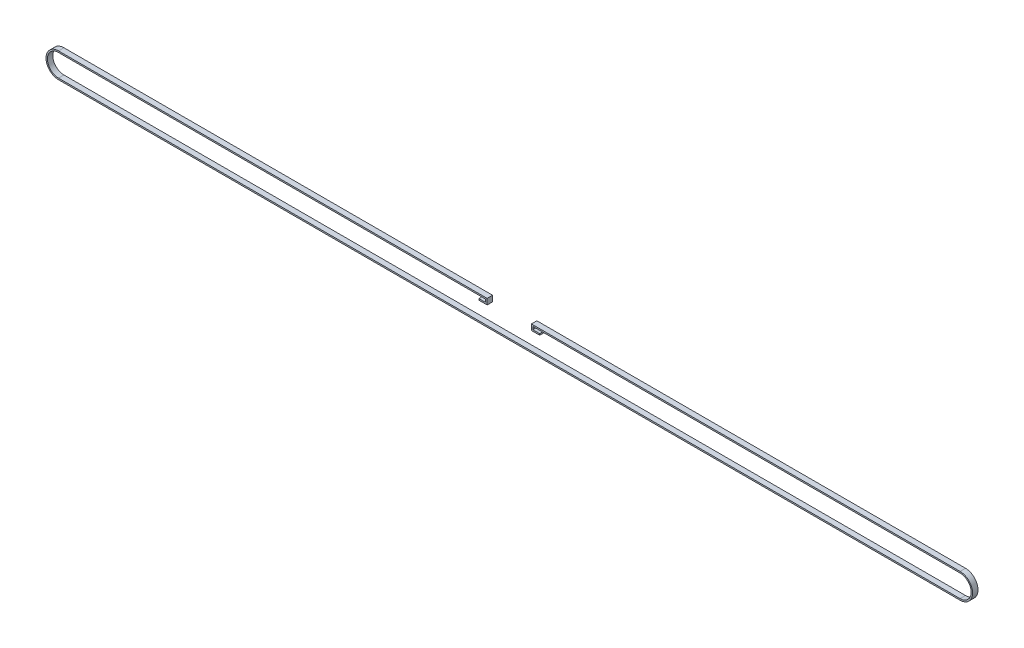
ISO-10303-21;
HEADER;
FILE_DESCRIPTION(('STEP AP214'),'2;1');
FILE_NAME('part.step','',(''),(''),'','','');
FILE_SCHEMA(('AUTOMOTIVE_DESIGN { 1 0 10303 214 1 1 1 1 }'));
ENDSEC;
DATA;
#1=APPLICATION_CONTEXT('core data for automotive mechanical design processes');
#2=APPLICATION_PROTOCOL_DEFINITION('international standard','automotive_design',2000,#1);
#3=PRODUCT_CONTEXT('',#1,'mechanical');
#4=PRODUCT('Part','Part','',(#3));
#5=PRODUCT_RELATED_PRODUCT_CATEGORY('part','',(#4));
#6=PRODUCT_DEFINITION_FORMATION('','',#4);
#7=PRODUCT_DEFINITION_CONTEXT('part definition',#1,'design');
#8=PRODUCT_DEFINITION('design','',#6,#7);
#9=PRODUCT_DEFINITION_SHAPE('','',#8);
#10=(LENGTH_UNIT() NAMED_UNIT(*) SI_UNIT(.MILLI.,.METRE.));
#11=(NAMED_UNIT(*) PLANE_ANGLE_UNIT() SI_UNIT($,.RADIAN.));
#12=(NAMED_UNIT(*) SI_UNIT($,.STERADIAN.) SOLID_ANGLE_UNIT());
#13=UNCERTAINTY_MEASURE_WITH_UNIT(LENGTH_MEASURE(1.E-05),#10,'distance_accuracy_value','');
#14=(GEOMETRIC_REPRESENTATION_CONTEXT(3) GLOBAL_UNCERTAINTY_ASSIGNED_CONTEXT((#13)) GLOBAL_UNIT_ASSIGNED_CONTEXT((#10,
#11,#12)) REPRESENTATION_CONTEXT('',''));
#15=CARTESIAN_POINT('',(0.,0.,0.));
#16=DIRECTION('',(0.,0.,1.));
#17=DIRECTION('',(1.,0.,0.));
#18=AXIS2_PLACEMENT_3D('',#15,#16,#17);
#19=CARTESIAN_POINT('',(-790.,21.9056000000001,4.76249999999988));
#20=DIRECTION('',(0.,-1.,0.));
#21=DIRECTION('',(0.,0.,-1.));
#22=AXIS2_PLACEMENT_3D('',#19,#20,#21);
#23=PLANE('',#22);
#24=DIRECTION('',(-1.,0.,0.));
#25=VECTOR('',#24,1.);
#26=CARTESIAN_POINT('',(-789.999999999999,21.9056,-4.76250000000002));
#27=LINE('',#26,#25);
#28=CARTESIAN_POINT('',(790.,21.9055999999999,-4.76249999999968));
#29=VERTEX_POINT('',#28);
#30=CARTESIAN_POINT('',(38.7499999999997,21.9055999999999,-4.7625));
#31=VERTEX_POINT('',#30);
#32=EDGE_CURVE('E323',#29,#31,#27,.T.);
#33=ORIENTED_EDGE('',*,*,#32,.T.);
#34=DIRECTION('',(0.,0.,1.));
#35=VECTOR('',#34,1.);
#36=CARTESIAN_POINT('',(38.7499999999997,21.9055999999999,-4.7625));
#37=LINE('',#36,#35);
#38=CARTESIAN_POINT('',(38.7499999999997,21.9056,4.76250000000002));
#39=VERTEX_POINT('',#38);
#40=EDGE_CURVE('E351',#31,#39,#37,.T.);
#41=ORIENTED_EDGE('',*,*,#40,.T.);
#42=DIRECTION('',(-1.,0.,0.));
#43=VECTOR('',#42,1.);
#44=CARTESIAN_POINT('',(-790.,21.9056000000001,4.76249999999988));
#45=LINE('',#44,#43);
#46=CARTESIAN_POINT('',(790.,21.9056,4.76250000000032));
#47=VERTEX_POINT('',#46);
#48=EDGE_CURVE('E313',#47,#39,#45,.T.);
#49=ORIENTED_EDGE('',*,*,#48,.F.);
#50=DIRECTION('',(0.,0.,-1.));
#51=VECTOR('',#50,1.);
#52=CARTESIAN_POINT('',(790.,21.9056,4.76250000000032));
#53=LINE('',#52,#51);
#54=EDGE_CURVE('E61',#47,#29,#53,.T.);
#55=ORIENTED_EDGE('',*,*,#54,.T.);
#56=EDGE_LOOP('',(#33,#41,#49,#55));
#57=FACE_BOUND('',#56,.T.);
#58=ADVANCED_FACE('F53',(#57),#23,.F.);
#59=CARTESIAN_POINT('',(790.,19.4056,4.76250000000043));
#60=DIRECTION('',(0.,-1.,0.));
#61=DIRECTION('',(0.,0.,-1.));
#62=AXIS2_PLACEMENT_3D('',#59,#60,#61);
#63=PLANE('',#62);
#64=DIRECTION('',(0.,0.,1.));
#65=VECTOR('',#64,1.);
#66=CARTESIAN_POINT('',(41.2500000000002,19.4056,4.76250000000003));
#67=LINE('',#66,#65);
#68=CARTESIAN_POINT('',(41.2500000000004,19.4055999999999,-4.76249999999999));
#69=VERTEX_POINT('',#68);
#70=CARTESIAN_POINT('',(41.2500000000004,19.4055999999999,4.76250000000002));
#71=VERTEX_POINT('',#70);
#72=EDGE_CURVE('E72',#69,#71,#67,.T.);
#73=ORIENTED_EDGE('',*,*,#72,.F.);
#74=DIRECTION('',(-1.,0.,0.));
#75=VECTOR('',#74,1.);
#76=CARTESIAN_POINT('',(790.,19.4055999999999,-4.76249999999963));
#77=LINE('',#76,#75);
#78=CARTESIAN_POINT('',(790.,19.4055999999999,-4.76249999999963));
#79=VERTEX_POINT('',#78);
#80=EDGE_CURVE('E290',#79,#69,#77,.T.);
#81=ORIENTED_EDGE('',*,*,#80,.F.);
#82=DIRECTION('',(0.,0.,-1.));
#83=VECTOR('',#82,1.);
#84=CARTESIAN_POINT('',(790.,19.4056,4.76250000000043));
#85=LINE('',#84,#83);
#86=CARTESIAN_POINT('',(790.,19.4056,4.76250000000043));
#87=VERTEX_POINT('',#86);
#88=EDGE_CURVE('E304',#87,#79,#85,.T.);
#89=ORIENTED_EDGE('',*,*,#88,.F.);
#90=DIRECTION('',(-1.,0.,0.));
#91=VECTOR('',#90,1.);
#92=CARTESIAN_POINT('',(790.,19.4056,4.76250000000043));
#93=LINE('',#92,#91);
#94=EDGE_CURVE('E68',#87,#71,#93,.T.);
#95=ORIENTED_EDGE('',*,*,#94,.T.);
#96=EDGE_LOOP('',(#73,#81,#89,#95));
#97=FACE_BOUND('',#96,.T.);
#98=ADVANCED_FACE('F369',(#97),#63,.T.);
#99=CARTESIAN_POINT('',(790.,-1.38777878078145E-13,4.76250000000027));
#100=DIRECTION('',(0.,0.,-1.));
#101=DIRECTION('',(-1.,0.,0.));
#102=AXIS2_PLACEMENT_3D('',#99,#100,#101);
#103=PLANE('',#102);
#104=DIRECTION('',(0.,1.,0.));
#105=VECTOR('',#104,1.);
#106=CARTESIAN_POINT('',(41.2500000000002,21.9056,4.76250000000004));
#107=LINE('',#106,#105);
#108=CARTESIAN_POINT('',(41.2500000000002,14.4056,4.76250000000002));
#109=VERTEX_POINT('',#108);
#110=EDGE_CURVE('E217',#109,#71,#107,.T.);
#111=ORIENTED_EDGE('',*,*,#110,.T.);
#112=ORIENTED_EDGE('',*,*,#94,.F.);
#113=CARTESIAN_POINT('',(790.,-1.38777878078145E-13,4.76250000000027));
#114=DIRECTION('',(0.,0.,1.));
#115=DIRECTION('',(1.,0.,0.));
#116=AXIS2_PLACEMENT_3D('',#113,#114,#115);
#117=CIRCLE('',#116,19.4056);
#118=CARTESIAN_POINT('',(790.,-19.4056000000001,4.76250000000027));
#119=VERTEX_POINT('',#118);
#120=EDGE_CURVE('E276',#119,#87,#117,.T.);
#121=ORIENTED_EDGE('',*,*,#120,.F.);
#122=DIRECTION('',(1.,0.,0.));
#123=VECTOR('',#122,1.);
#124=CARTESIAN_POINT('',(-790.,-19.4055999999999,4.7624999999998));
#125=LINE('',#124,#123);
#126=CARTESIAN_POINT('',(-790.,-19.4056,4.76249999999971));
#127=VERTEX_POINT('',#126);
#128=EDGE_CURVE('E284',#127,#119,#125,.T.);
#129=ORIENTED_EDGE('',*,*,#128,.F.);
#130=CARTESIAN_POINT('',(-790.,0.,4.76249999999999));
#131=DIRECTION('',(0.,0.,1.));
#132=DIRECTION('',(1.,0.,0.));
#133=AXIS2_PLACEMENT_3D('',#130,#131,#132);
#134=CIRCLE('',#133,19.4056);
#135=CARTESIAN_POINT('',(-790.,19.4056,4.76249999999993));
#136=VERTEX_POINT('',#135);
#137=EDGE_CURVE('E281',#136,#127,#134,.T.);
#138=ORIENTED_EDGE('',*,*,#137,.F.);
#139=CARTESIAN_POINT('',(-41.25,19.4056,4.7625));
#140=VERTEX_POINT('',#139);
#141=EDGE_CURVE('E278',#140,#136,#93,.T.);
#142=ORIENTED_EDGE('',*,*,#141,.F.);
#143=DIRECTION('',(0.,-1.,0.));
#144=VECTOR('',#143,1.);
#145=CARTESIAN_POINT('',(-41.2500000000002,21.9055999999999,4.7625));
#146=LINE('',#145,#144);
#147=CARTESIAN_POINT('',(-41.2500000000002,14.4056,4.76250000000001));
#148=VERTEX_POINT('',#147);
#149=EDGE_CURVE('E254',#140,#148,#146,.T.);
#150=ORIENTED_EDGE('',*,*,#149,.T.);
#151=DIRECTION('',(-1.,0.,0.));
#152=VECTOR('',#151,1.);
#153=CARTESIAN_POINT('',(-41.2500000000002,14.4056,4.76250000000001));
#154=LINE('',#153,#152);
#155=CARTESIAN_POINT('',(-53.2500000000002,14.4056,4.76249999999998));
#156=VERTEX_POINT('',#155);
#157=EDGE_CURVE('E256',#148,#156,#154,.T.);
#158=ORIENTED_EDGE('',*,*,#157,.T.);
#159=DIRECTION('',(0.,-1.,0.));
#160=VECTOR('',#159,1.);
#161=CARTESIAN_POINT('',(-53.2500000000002,14.4056,4.76249999999998));
#162=LINE('',#161,#160);
#163=CARTESIAN_POINT('',(-53.2500000000002,11.9056,4.76249999999999));
#164=VERTEX_POINT('',#163);
#165=EDGE_CURVE('E259',#156,#164,#162,.T.);
#166=ORIENTED_EDGE('',*,*,#165,.T.);
#167=DIRECTION('',(1.,0.,0.));
#168=VECTOR('',#167,1.);
#169=CARTESIAN_POINT('',(-53.2500000000002,11.9056,4.76249999999999));
#170=LINE('',#169,#168);
#171=CARTESIAN_POINT('',(-38.7499999999997,11.9056,4.76249999999998));
#172=VERTEX_POINT('',#171);
#173=EDGE_CURVE('E240',#164,#172,#170,.T.);
#174=ORIENTED_EDGE('',*,*,#173,.T.);
#175=DIRECTION('',(0.,1.,0.));
#176=VECTOR('',#175,1.);
#177=CARTESIAN_POINT('',(-38.7499999999997,11.9056,4.76249999999998));
#178=LINE('',#177,#176);
#179=CARTESIAN_POINT('',(-38.7499999999997,21.9056,4.76249999999998));
#180=VERTEX_POINT('',#179);
#181=EDGE_CURVE('E235',#172,#180,#178,.T.);
#182=ORIENTED_EDGE('',*,*,#181,.T.);
#183=CARTESIAN_POINT('',(-790.,21.9056000000001,4.76249999999988));
#184=VERTEX_POINT('',#183);
#185=EDGE_CURVE('E311',#180,#184,#45,.T.);
#186=ORIENTED_EDGE('',*,*,#185,.T.);
#187=CARTESIAN_POINT('',(-790.,0.,4.76249999999999));
#188=DIRECTION('',(0.,0.,1.));
#189=DIRECTION('',(-1.,0.,0.));
#190=AXIS2_PLACEMENT_3D('',#187,#188,#189);
#191=CIRCLE('',#190,21.9056);
#192=CARTESIAN_POINT('',(-790.,-21.9055999999999,4.76249999999982));
#193=VERTEX_POINT('',#192);
#194=EDGE_CURVE('E315',#184,#193,#191,.T.);
#195=ORIENTED_EDGE('',*,*,#194,.T.);
#196=DIRECTION('',(1.,0.,0.));
#197=VECTOR('',#196,1.);
#198=CARTESIAN_POINT('',(790.,-21.9056000000001,4.76250000000032));
#199=LINE('',#198,#197);
#200=CARTESIAN_POINT('',(790.,-21.9056000000001,4.76250000000032));
#201=VERTEX_POINT('',#200);
#202=EDGE_CURVE('E317',#193,#201,#199,.T.);
#203=ORIENTED_EDGE('',*,*,#202,.T.);
#204=CARTESIAN_POINT('',(790.,-1.38777878078145E-13,4.76250000000027));
#205=DIRECTION('',(0.,0.,1.));
#206=DIRECTION('',(-1.,0.,0.));
#207=AXIS2_PLACEMENT_3D('',#204,#205,#206);
#208=CIRCLE('',#207,21.9056);
#209=EDGE_CURVE('E308',#201,#47,#208,.T.);
#210=ORIENTED_EDGE('',*,*,#209,.T.);
#211=ORIENTED_EDGE('',*,*,#48,.T.);
#212=DIRECTION('',(0.,-1.,0.));
#213=VECTOR('',#212,1.);
#214=CARTESIAN_POINT('',(38.7499999999997,11.9056,4.7625));
#215=LINE('',#214,#213);
#216=CARTESIAN_POINT('',(38.7499999999997,11.9056,4.7625));
#217=VERTEX_POINT('',#216);
#218=EDGE_CURVE('E214',#39,#217,#215,.T.);
#219=ORIENTED_EDGE('',*,*,#218,.T.);
#220=DIRECTION('',(1.,0.,0.));
#221=VECTOR('',#220,1.);
#222=CARTESIAN_POINT('',(53.2500000000002,11.9056,4.76250000000004));
#223=LINE('',#222,#221);
#224=CARTESIAN_POINT('',(53.2500000000002,11.9056,4.76250000000004));
#225=VERTEX_POINT('',#224);
#226=EDGE_CURVE('E193',#217,#225,#223,.T.);
#227=ORIENTED_EDGE('',*,*,#226,.T.);
#228=DIRECTION('',(0.,1.,0.));
#229=VECTOR('',#228,1.);
#230=CARTESIAN_POINT('',(53.2500000000002,14.4056,4.76250000000004));
#231=LINE('',#230,#229);
#232=CARTESIAN_POINT('',(53.2500000000002,14.4056,4.76250000000004));
#233=VERTEX_POINT('',#232);
#234=EDGE_CURVE('E202',#225,#233,#231,.T.);
#235=ORIENTED_EDGE('',*,*,#234,.T.);
#236=DIRECTION('',(-1.,0.,0.));
#237=VECTOR('',#236,1.);
#238=CARTESIAN_POINT('',(41.2500000000002,14.4056,4.76250000000002));
#239=LINE('',#238,#237);
#240=EDGE_CURVE('E208',#233,#109,#239,.T.);
#241=ORIENTED_EDGE('',*,*,#240,.T.);
#242=EDGE_LOOP('',(#111,#112,#121,#129,#138,#142,#150,#158,#166,#174,#182,#186,#195,#203,#210,
#211,#219,#227,#235,#241));
#243=FACE_BOUND('',#242,.T.);
#244=ADVANCED_FACE('F212',(#243),#103,.F.);
#245=CARTESIAN_POINT('',(790.,-1.38777878078145E-13,-4.76249999999974));
#246=DIRECTION('',(0.,0.,-1.));
#247=DIRECTION('',(-1.,0.,0.));
#248=AXIS2_PLACEMENT_3D('',#245,#246,#247);
#249=PLANE('',#248);
#250=ORIENTED_EDGE('',*,*,#80,.T.);
#251=DIRECTION('',(0.,1.,0.));
#252=VECTOR('',#251,1.);
#253=CARTESIAN_POINT('',(41.2500000000002,21.9056,-4.76249999999996));
#254=LINE('',#253,#252);
#255=CARTESIAN_POINT('',(41.2500000000002,14.4056,-4.76249999999999));
#256=VERTEX_POINT('',#255);
#257=EDGE_CURVE('E229',#256,#69,#254,.T.);
#258=ORIENTED_EDGE('',*,*,#257,.F.);
#259=DIRECTION('',(-1.,0.,0.));
#260=VECTOR('',#259,1.);
#261=CARTESIAN_POINT('',(41.2500000000002,14.4056,-4.76249999999999));
#262=LINE('',#261,#260);
#263=CARTESIAN_POINT('',(53.2500000000002,14.4056,-4.76249999999996));
#264=VERTEX_POINT('',#263);
#265=EDGE_CURVE('E219',#264,#256,#262,.T.);
#266=ORIENTED_EDGE('',*,*,#265,.F.);
#267=DIRECTION('',(0.,1.,0.));
#268=VECTOR('',#267,1.);
#269=CARTESIAN_POINT('',(53.2500000000002,14.4056,-4.76249999999996));
#270=LINE('',#269,#268);
#271=CARTESIAN_POINT('',(53.2500000000002,11.9056,-4.76249999999996));
#272=VERTEX_POINT('',#271);
#273=EDGE_CURVE('E215',#272,#264,#270,.T.);
#274=ORIENTED_EDGE('',*,*,#273,.F.);
#275=DIRECTION('',(1.,0.,0.));
#276=VECTOR('',#275,1.);
#277=CARTESIAN_POINT('',(53.2500000000002,11.9056,-4.76249999999996));
#278=LINE('',#277,#276);
#279=CARTESIAN_POINT('',(38.7499999999997,11.9056,-4.7625));
#280=VERTEX_POINT('',#279);
#281=EDGE_CURVE('E195',#280,#272,#278,.T.);
#282=ORIENTED_EDGE('',*,*,#281,.F.);
#283=DIRECTION('',(0.,-1.,0.));
#284=VECTOR('',#283,1.);
#285=CARTESIAN_POINT('',(38.7499999999997,11.9056,-4.7625));
#286=LINE('',#285,#284);
#287=EDGE_CURVE('E226',#31,#280,#286,.T.);
#288=ORIENTED_EDGE('',*,*,#287,.F.);
#289=ORIENTED_EDGE('',*,*,#32,.F.);
#290=CARTESIAN_POINT('',(790.,-1.38777878078145E-13,-4.76249999999974));
#291=DIRECTION('',(0.,0.,1.));
#292=DIRECTION('',(-1.,0.,0.));
#293=AXIS2_PLACEMENT_3D('',#290,#291,#292);
#294=CIRCLE('',#293,21.9056);
#295=CARTESIAN_POINT('',(790.,-21.9056,-4.76249999999968));
#296=VERTEX_POINT('',#295);
#297=EDGE_CURVE('E307',#296,#29,#294,.T.);
#298=ORIENTED_EDGE('',*,*,#297,.F.);
#299=DIRECTION('',(1.,0.,0.));
#300=VECTOR('',#299,1.);
#301=CARTESIAN_POINT('',(790.,-21.9056,-4.76249999999968));
#302=LINE('',#301,#300);
#303=CARTESIAN_POINT('',(-790.,-21.9056,-4.76250000000018));
#304=VERTEX_POINT('',#303);
#305=EDGE_CURVE('E312',#304,#296,#302,.T.);
#306=ORIENTED_EDGE('',*,*,#305,.F.);
#307=CARTESIAN_POINT('',(-790.,0.,-4.76249999999999));
#308=DIRECTION('',(0.,0.,1.));
#309=DIRECTION('',(-1.,0.,0.));
#310=AXIS2_PLACEMENT_3D('',#307,#308,#309);
#311=CIRCLE('',#310,21.9056);
#312=CARTESIAN_POINT('',(-789.999999999999,21.9056,-4.76250000000002));
#313=VERTEX_POINT('',#312);
#314=EDGE_CURVE('E325',#313,#304,#311,.T.);
#315=ORIENTED_EDGE('',*,*,#314,.F.);
#316=CARTESIAN_POINT('',(-38.7499999999997,21.9056,-4.76250000000002));
#317=VERTEX_POINT('',#316);
#318=EDGE_CURVE('E322',#317,#313,#27,.T.);
#319=ORIENTED_EDGE('',*,*,#318,.F.);
#320=DIRECTION('',(0.,1.,0.));
#321=VECTOR('',#320,1.);
#322=CARTESIAN_POINT('',(-38.7499999999997,11.9056,-4.76250000000002));
#323=LINE('',#322,#321);
#324=CARTESIAN_POINT('',(-38.7499999999997,11.9056,-4.76250000000002));
#325=VERTEX_POINT('',#324);
#326=EDGE_CURVE('E236',#325,#317,#323,.T.);
#327=ORIENTED_EDGE('',*,*,#326,.F.);
#328=DIRECTION('',(1.,0.,0.));
#329=VECTOR('',#328,1.);
#330=CARTESIAN_POINT('',(-53.2500000000002,11.9055999999999,-4.76250000000002));
#331=LINE('',#330,#329);
#332=CARTESIAN_POINT('',(-53.2500000000002,11.9055999999999,-4.76250000000002));
#333=VERTEX_POINT('',#332);
#334=EDGE_CURVE('E248',#333,#325,#331,.T.);
#335=ORIENTED_EDGE('',*,*,#334,.F.);
#336=DIRECTION('',(0.,-1.,0.));
#337=VECTOR('',#336,1.);
#338=CARTESIAN_POINT('',(-53.2500000000002,14.4056,-4.76250000000002));
#339=LINE('',#338,#337);
#340=CARTESIAN_POINT('',(-53.2500000000002,14.4056,-4.76250000000002));
#341=VERTEX_POINT('',#340);
#342=EDGE_CURVE('E245',#341,#333,#339,.T.);
#343=ORIENTED_EDGE('',*,*,#342,.F.);
#344=DIRECTION('',(-1.,0.,0.));
#345=VECTOR('',#344,1.);
#346=CARTESIAN_POINT('',(-41.2500000000003,14.4056,-4.76250000000002));
#347=LINE('',#346,#345);
#348=CARTESIAN_POINT('',(-41.2500000000003,14.4056,-4.76250000000002));
#349=VERTEX_POINT('',#348);
#350=EDGE_CURVE('E242',#349,#341,#347,.T.);
#351=ORIENTED_EDGE('',*,*,#350,.F.);
#352=DIRECTION('',(0.,-1.,0.));
#353=VECTOR('',#352,1.);
#354=CARTESIAN_POINT('',(-41.2500000000003,21.9056,-4.76249999999999));
#355=LINE('',#354,#353);
#356=CARTESIAN_POINT('',(-41.25,19.4056,-4.76250000000003));
#357=VERTEX_POINT('',#356);
#358=EDGE_CURVE('E239',#357,#349,#355,.T.);
#359=ORIENTED_EDGE('',*,*,#358,.F.);
#360=CARTESIAN_POINT('',(-789.999999999999,19.4056,-4.76250000000004));
#361=VERTEX_POINT('',#360);
#362=EDGE_CURVE('E289',#357,#361,#77,.T.);
#363=ORIENTED_EDGE('',*,*,#362,.T.);
#364=CARTESIAN_POINT('',(-790.,0.,-4.76249999999999));
#365=DIRECTION('',(0.,0.,1.));
#366=DIRECTION('',(1.,0.,0.));
#367=AXIS2_PLACEMENT_3D('',#364,#365,#366);
#368=CIRCLE('',#367,19.4056);
#369=CARTESIAN_POINT('',(-789.999999999999,-19.4056,-4.76250000000007));
#370=VERTEX_POINT('',#369);
#371=EDGE_CURVE('E292',#361,#370,#368,.T.);
#372=ORIENTED_EDGE('',*,*,#371,.T.);
#373=DIRECTION('',(1.,0.,0.));
#374=VECTOR('',#373,1.);
#375=CARTESIAN_POINT('',(-789.999999999999,-19.4056,-4.76250000000007));
#376=LINE('',#375,#374);
#377=CARTESIAN_POINT('',(790.,-19.4056000000001,-4.76249999999957));
#378=VERTEX_POINT('',#377);
#379=EDGE_CURVE('E279',#370,#378,#376,.T.);
#380=ORIENTED_EDGE('',*,*,#379,.T.);
#381=CARTESIAN_POINT('',(790.,-1.38777878078145E-13,-4.76249999999974));
#382=DIRECTION('',(0.,0.,1.));
#383=DIRECTION('',(1.,0.,0.));
#384=AXIS2_PLACEMENT_3D('',#381,#382,#383);
#385=CIRCLE('',#384,19.4056);
#386=EDGE_CURVE('E266',#378,#79,#385,.T.);
#387=ORIENTED_EDGE('',*,*,#386,.T.);
#388=EDGE_LOOP('',(#250,#258,#266,#274,#282,#288,#289,#298,#306,#315,#319,#327,#335,#343,#351,
#359,#363,#372,#380,#387));
#389=FACE_BOUND('',#388,.T.);
#390=ADVANCED_FACE('F346',(#389),#249,.T.);
#391=CARTESIAN_POINT('',(790.,-1.38777878078145E-13,4.76250000000027));
#392=DIRECTION('',(0.,0.,-1.));
#393=DIRECTION('',(-1.,0.,0.));
#394=AXIS2_PLACEMENT_3D('',#391,#392,#393);
#395=CYLINDRICAL_SURFACE('',#394,21.9056);
#396=ORIENTED_EDGE('',*,*,#297,.T.);
#397=ORIENTED_EDGE('',*,*,#54,.F.);
#398=ORIENTED_EDGE('',*,*,#209,.F.);
#399=DIRECTION('',(0.,0.,-1.));
#400=VECTOR('',#399,1.);
#401=CARTESIAN_POINT('',(790.,-21.9056000000001,4.76250000000032));
#402=LINE('',#401,#400);
#403=EDGE_CURVE('E319',#201,#296,#402,.T.);
#404=ORIENTED_EDGE('',*,*,#403,.T.);
#405=EDGE_LOOP('',(#396,#397,#398,#404));
#406=FACE_BOUND('',#405,.T.);
#407=ADVANCED_FACE('F55',(#406),#395,.T.);
#408=DIRECTION('',(0.,0.,-1.));
#409=VECTOR('',#408,1.);
#410=CARTESIAN_POINT('',(-790.,21.9056000000001,4.76249999999988));
#411=LINE('',#410,#409);
#412=EDGE_CURVE('E333',#184,#313,#411,.T.);
#413=ORIENTED_EDGE('',*,*,#412,.F.);
#414=ORIENTED_EDGE('',*,*,#185,.F.);
#415=DIRECTION('',(0.,0.,1.));
#416=VECTOR('',#415,1.);
#417=CARTESIAN_POINT('',(-38.7499999999997,21.9056,-4.76250000000002));
#418=LINE('',#417,#416);
#419=EDGE_CURVE('E251',#317,#180,#418,.T.);
#420=ORIENTED_EDGE('',*,*,#419,.F.);
#421=ORIENTED_EDGE('',*,*,#318,.T.);
#422=EDGE_LOOP('',(#413,#414,#420,#421));
#423=FACE_BOUND('',#422,.T.);
#424=ADVANCED_FACE('F403',(#423),#23,.F.);
#425=CARTESIAN_POINT('',(-790.,0.,4.76249999999999));
#426=DIRECTION('',(0.,0.,-1.));
#427=DIRECTION('',(-1.,0.,0.));
#428=AXIS2_PLACEMENT_3D('',#425,#426,#427);
#429=CYLINDRICAL_SURFACE('',#428,21.9056);
#430=ORIENTED_EDGE('',*,*,#314,.T.);
#431=DIRECTION('',(0.,0.,-1.));
#432=VECTOR('',#431,1.);
#433=CARTESIAN_POINT('',(-790.,-21.9055999999999,4.76249999999982));
#434=LINE('',#433,#432);
#435=EDGE_CURVE('E330',#193,#304,#434,.T.);
#436=ORIENTED_EDGE('',*,*,#435,.F.);
#437=ORIENTED_EDGE('',*,*,#194,.F.);
#438=ORIENTED_EDGE('',*,*,#412,.T.);
#439=EDGE_LOOP('',(#430,#436,#437,#438));
#440=FACE_BOUND('',#439,.T.);
#441=ADVANCED_FACE('F405',(#440),#429,.T.);
#442=CARTESIAN_POINT('',(790.,-21.9056000000001,4.76250000000032));
#443=DIRECTION('',(0.,1.,0.));
#444=DIRECTION('',(0.,0.,1.));
#445=AXIS2_PLACEMENT_3D('',#442,#443,#444);
#446=PLANE('',#445);
#447=ORIENTED_EDGE('',*,*,#305,.T.);
#448=ORIENTED_EDGE('',*,*,#403,.F.);
#449=ORIENTED_EDGE('',*,*,#202,.F.);
#450=ORIENTED_EDGE('',*,*,#435,.T.);
#451=EDGE_LOOP('',(#447,#448,#449,#450));
#452=FACE_BOUND('',#451,.T.);
#453=ADVANCED_FACE('F408',(#452),#446,.F.);
#454=CARTESIAN_POINT('',(790.,-1.38777878078145E-13,4.76250000000027));
#455=DIRECTION('',(0.,0.,-1.));
#456=DIRECTION('',(-1.,0.,0.));
#457=AXIS2_PLACEMENT_3D('',#454,#455,#456);
#458=CYLINDRICAL_SURFACE('',#457,19.4056);
#459=ORIENTED_EDGE('',*,*,#386,.F.);
#460=DIRECTION('',(0.,0.,-1.));
#461=VECTOR('',#460,1.);
#462=CARTESIAN_POINT('',(790.,-19.4056000000001,4.76250000000027));
#463=LINE('',#462,#461);
#464=EDGE_CURVE('E286',#119,#378,#463,.T.);
#465=ORIENTED_EDGE('',*,*,#464,.F.);
#466=ORIENTED_EDGE('',*,*,#120,.T.);
#467=ORIENTED_EDGE('',*,*,#88,.T.);
#468=EDGE_LOOP('',(#459,#465,#466,#467));
#469=FACE_BOUND('',#468,.T.);
#470=ADVANCED_FACE('F368',(#469),#458,.F.);
#471=DIRECTION('',(0.,0.,-1.));
#472=VECTOR('',#471,1.);
#473=CARTESIAN_POINT('',(-41.2500000000002,19.4056,4.7625));
#474=LINE('',#473,#472);
#475=EDGE_CURVE('E13',#140,#357,#474,.T.);
#476=ORIENTED_EDGE('',*,*,#475,.F.);
#477=ORIENTED_EDGE('',*,*,#141,.T.);
#478=DIRECTION('',(0.,0.,-1.));
#479=VECTOR('',#478,1.);
#480=CARTESIAN_POINT('',(-790.,19.4056,4.76249999999993));
#481=LINE('',#480,#479);
#482=EDGE_CURVE('E301',#136,#361,#481,.T.);
#483=ORIENTED_EDGE('',*,*,#482,.T.);
#484=ORIENTED_EDGE('',*,*,#362,.F.);
#485=EDGE_LOOP('',(#476,#477,#483,#484));
#486=FACE_BOUND('',#485,.T.);
#487=ADVANCED_FACE('F415',(#486),#63,.T.);
#488=CARTESIAN_POINT('',(-790.,0.,4.76249999999999));
#489=DIRECTION('',(0.,0.,-1.));
#490=DIRECTION('',(-1.,0.,0.));
#491=AXIS2_PLACEMENT_3D('',#488,#489,#490);
#492=CYLINDRICAL_SURFACE('',#491,19.4056);
#493=ORIENTED_EDGE('',*,*,#371,.F.);
#494=ORIENTED_EDGE('',*,*,#482,.F.);
#495=ORIENTED_EDGE('',*,*,#137,.T.);
#496=DIRECTION('',(0.,0.,-1.));
#497=VECTOR('',#496,1.);
#498=CARTESIAN_POINT('',(-790.,-19.4055999999999,4.7624999999998));
#499=LINE('',#498,#497);
#500=EDGE_CURVE('E299',#127,#370,#499,.T.);
#501=ORIENTED_EDGE('',*,*,#500,.T.);
#502=EDGE_LOOP('',(#493,#494,#495,#501));
#503=FACE_BOUND('',#502,.T.);
#504=ADVANCED_FACE('F376',(#503),#492,.F.);
#505=CARTESIAN_POINT('',(-790.,-19.4055999999999,4.7624999999998));
#506=DIRECTION('',(0.,1.,0.));
#507=DIRECTION('',(0.,0.,1.));
#508=AXIS2_PLACEMENT_3D('',#505,#506,#507);
#509=PLANE('',#508);
#510=ORIENTED_EDGE('',*,*,#379,.F.);
#511=ORIENTED_EDGE('',*,*,#500,.F.);
#512=ORIENTED_EDGE('',*,*,#128,.T.);
#513=ORIENTED_EDGE('',*,*,#464,.T.);
#514=EDGE_LOOP('',(#510,#511,#512,#513));
#515=FACE_BOUND('',#514,.T.);
#516=ADVANCED_FACE('F372',(#515),#509,.T.);
#517=CARTESIAN_POINT('',(-38.7499999999997,11.9056,-4.76250000000002));
#518=DIRECTION('',(1.,0.,0.));
#519=DIRECTION('',(0.,0.,-1.));
#520=AXIS2_PLACEMENT_3D('',#517,#518,#519);
#521=PLANE('',#520);
#522=ORIENTED_EDGE('',*,*,#181,.F.);
#523=DIRECTION('',(0.,0.,1.));
#524=VECTOR('',#523,1.);
#525=CARTESIAN_POINT('',(-38.7499999999997,11.9056,-4.76250000000002));
#526=LINE('',#525,#524);
#527=EDGE_CURVE('E264',#325,#172,#526,.T.);
#528=ORIENTED_EDGE('',*,*,#527,.F.);
#529=ORIENTED_EDGE('',*,*,#326,.T.);
#530=ORIENTED_EDGE('',*,*,#419,.T.);
#531=EDGE_LOOP('',(#522,#528,#529,#530));
#532=FACE_BOUND('',#531,.T.);
#533=ADVANCED_FACE('F397',(#532),#521,.T.);
#534=CARTESIAN_POINT('',(-53.2500000000002,11.9055999999999,-4.76250000000002));
#535=DIRECTION('',(0.,-1.,0.));
#536=DIRECTION('',(1.,0.,0.));
#537=AXIS2_PLACEMENT_3D('',#534,#535,#536);
#538=PLANE('',#537);
#539=ORIENTED_EDGE('',*,*,#173,.F.);
#540=DIRECTION('',(0.,0.,1.));
#541=VECTOR('',#540,1.);
#542=CARTESIAN_POINT('',(-53.2500000000002,11.9055999999999,-4.76250000000002));
#543=LINE('',#542,#541);
#544=EDGE_CURVE('E267',#333,#164,#543,.T.);
#545=ORIENTED_EDGE('',*,*,#544,.F.);
#546=ORIENTED_EDGE('',*,*,#334,.T.);
#547=ORIENTED_EDGE('',*,*,#527,.T.);
#548=EDGE_LOOP('',(#539,#545,#546,#547));
#549=FACE_BOUND('',#548,.T.);
#550=ADVANCED_FACE('F392',(#549),#538,.T.);
#551=CARTESIAN_POINT('',(-53.2500000000002,14.4056,-4.76250000000002));
#552=DIRECTION('',(-1.,0.,0.));
#553=DIRECTION('',(0.,0.,1.));
#554=AXIS2_PLACEMENT_3D('',#551,#552,#553);
#555=PLANE('',#554);
#556=ORIENTED_EDGE('',*,*,#165,.F.);
#557=DIRECTION('',(0.,0.,1.));
#558=VECTOR('',#557,1.);
#559=CARTESIAN_POINT('',(-53.2500000000002,14.4056,-4.76250000000002));
#560=LINE('',#559,#558);
#561=EDGE_CURVE('E269',#341,#156,#560,.T.);
#562=ORIENTED_EDGE('',*,*,#561,.F.);
#563=ORIENTED_EDGE('',*,*,#342,.T.);
#564=ORIENTED_EDGE('',*,*,#544,.T.);
#565=EDGE_LOOP('',(#556,#562,#563,#564));
#566=FACE_BOUND('',#565,.T.);
#567=ADVANCED_FACE('F447',(#566),#555,.T.);
#568=CARTESIAN_POINT('',(-41.2500000000003,14.4056,-4.76250000000002));
#569=DIRECTION('',(0.,1.,0.));
#570=DIRECTION('',(-1.,0.,0.));
#571=AXIS2_PLACEMENT_3D('',#568,#569,#570);
#572=PLANE('',#571);
#573=ORIENTED_EDGE('',*,*,#157,.F.);
#574=DIRECTION('',(0.,0.,1.));
#575=VECTOR('',#574,1.);
#576=CARTESIAN_POINT('',(-41.2500000000003,14.4056,-4.76250000000002));
#577=LINE('',#576,#575);
#578=EDGE_CURVE('E271',#349,#148,#577,.T.);
#579=ORIENTED_EDGE('',*,*,#578,.F.);
#580=ORIENTED_EDGE('',*,*,#350,.T.);
#581=ORIENTED_EDGE('',*,*,#561,.T.);
#582=EDGE_LOOP('',(#573,#579,#580,#581));
#583=FACE_BOUND('',#582,.T.);
#584=ADVANCED_FACE('F387',(#583),#572,.T.);
#585=CARTESIAN_POINT('',(-41.2500000000003,21.9056,-4.76249999999999));
#586=DIRECTION('',(-1.,0.,0.));
#587=DIRECTION('',(0.,0.,1.));
#588=AXIS2_PLACEMENT_3D('',#585,#586,#587);
#589=PLANE('',#588);
#590=ORIENTED_EDGE('',*,*,#149,.F.);
#591=ORIENTED_EDGE('',*,*,#475,.T.);
#592=ORIENTED_EDGE('',*,*,#358,.T.);
#593=ORIENTED_EDGE('',*,*,#578,.T.);
#594=EDGE_LOOP('',(#590,#591,#592,#593));
#595=FACE_BOUND('',#594,.T.);
#596=ADVANCED_FACE('F381',(#595),#589,.T.);
#597=CARTESIAN_POINT('',(53.2500000000002,14.4056,-4.76249999999996));
#598=DIRECTION('',(1.,0.,0.));
#599=DIRECTION('',(0.,0.,-1.));
#600=AXIS2_PLACEMENT_3D('',#597,#598,#599);
#601=PLANE('',#600);
#602=ORIENTED_EDGE('',*,*,#234,.F.);
#603=DIRECTION('',(0.,0.,1.));
#604=VECTOR('',#603,1.);
#605=CARTESIAN_POINT('',(53.2500000000002,11.9056,-4.76249999999996));
#606=LINE('',#605,#604);
#607=EDGE_CURVE('E189',#272,#225,#606,.T.);
#608=ORIENTED_EDGE('',*,*,#607,.F.);
#609=ORIENTED_EDGE('',*,*,#273,.T.);
#610=DIRECTION('',(0.,0.,1.));
#611=VECTOR('',#610,1.);
#612=CARTESIAN_POINT('',(53.2500000000002,14.4056,-4.76249999999996));
#613=LINE('',#612,#611);
#614=EDGE_CURVE('E204',#264,#233,#613,.T.);
#615=ORIENTED_EDGE('',*,*,#614,.T.);
#616=EDGE_LOOP('',(#602,#608,#609,#615));
#617=FACE_BOUND('',#616,.T.);
#618=ADVANCED_FACE('F203',(#617),#601,.T.);
#619=CARTESIAN_POINT('',(53.2500000000002,11.9056,-4.76249999999996));
#620=DIRECTION('',(0.,-1.,0.));
#621=DIRECTION('',(1.,0.,0.));
#622=AXIS2_PLACEMENT_3D('',#619,#620,#621);
#623=PLANE('',#622);
#624=ORIENTED_EDGE('',*,*,#226,.F.);
#625=DIRECTION('',(0.,0.,1.));
#626=VECTOR('',#625,1.);
#627=CARTESIAN_POINT('',(38.7499999999997,11.9056,-4.7625));
#628=LINE('',#627,#626);
#629=EDGE_CURVE('E199',#280,#217,#628,.T.);
#630=ORIENTED_EDGE('',*,*,#629,.F.);
#631=ORIENTED_EDGE('',*,*,#281,.T.);
#632=ORIENTED_EDGE('',*,*,#607,.T.);
#633=EDGE_LOOP('',(#624,#630,#631,#632));
#634=FACE_BOUND('',#633,.T.);
#635=ADVANCED_FACE('F191',(#634),#623,.T.);
#636=CARTESIAN_POINT('',(38.7499999999997,11.9056,-4.7625));
#637=DIRECTION('',(-1.,0.,0.));
#638=DIRECTION('',(0.,0.,1.));
#639=AXIS2_PLACEMENT_3D('',#636,#637,#638);
#640=PLANE('',#639);
#641=ORIENTED_EDGE('',*,*,#218,.F.);
#642=ORIENTED_EDGE('',*,*,#40,.F.);
#643=ORIENTED_EDGE('',*,*,#287,.T.);
#644=ORIENTED_EDGE('',*,*,#629,.T.);
#645=EDGE_LOOP('',(#641,#642,#643,#644));
#646=FACE_BOUND('',#645,.T.);
#647=ADVANCED_FACE('F350',(#646),#640,.T.);
#648=CARTESIAN_POINT('',(41.2500000000002,21.9056,-4.76249999999996));
#649=DIRECTION('',(1.,0.,0.));
#650=DIRECTION('',(0.,0.,-1.));
#651=AXIS2_PLACEMENT_3D('',#648,#649,#650);
#652=PLANE('',#651);
#653=ORIENTED_EDGE('',*,*,#257,.T.);
#654=ORIENTED_EDGE('',*,*,#72,.T.);
#655=ORIENTED_EDGE('',*,*,#110,.F.);
#656=DIRECTION('',(0.,0.,1.));
#657=VECTOR('',#656,1.);
#658=CARTESIAN_POINT('',(41.2500000000002,14.4056,-4.76249999999999));
#659=LINE('',#658,#657);
#660=EDGE_CURVE('E352',#256,#109,#659,.T.);
#661=ORIENTED_EDGE('',*,*,#660,.F.);
#662=EDGE_LOOP('',(#653,#654,#655,#661));
#663=FACE_BOUND('',#662,.T.);
#664=ADVANCED_FACE('F362',(#663),#652,.T.);
#665=CARTESIAN_POINT('',(41.2500000000002,14.4056,-4.76249999999999));
#666=DIRECTION('',(0.,1.,0.));
#667=DIRECTION('',(-1.,0.,0.));
#668=AXIS2_PLACEMENT_3D('',#665,#666,#667);
#669=PLANE('',#668);
#670=ORIENTED_EDGE('',*,*,#240,.F.);
#671=ORIENTED_EDGE('',*,*,#614,.F.);
#672=ORIENTED_EDGE('',*,*,#265,.T.);
#673=ORIENTED_EDGE('',*,*,#660,.T.);
#674=EDGE_LOOP('',(#670,#671,#672,#673));
#675=FACE_BOUND('',#674,.T.);
#676=ADVANCED_FACE('F358',(#675),#669,.T.);
#677=CLOSED_SHELL('',(#58,#98,#244,#390,#407,#424,#441,#453,#470,#487,#504,#516,#533,#550,#567,
#584,#596,#618,#635,#647,#664,#676));
#678=MANIFOLD_SOLID_BREP('B2',#677);
#679=ADVANCED_BREP_SHAPE_REPRESENTATION('',(#18,#678),#14);
#680=SHAPE_DEFINITION_REPRESENTATION(#9,#679);
ENDSEC;
END-ISO-10303-21;
